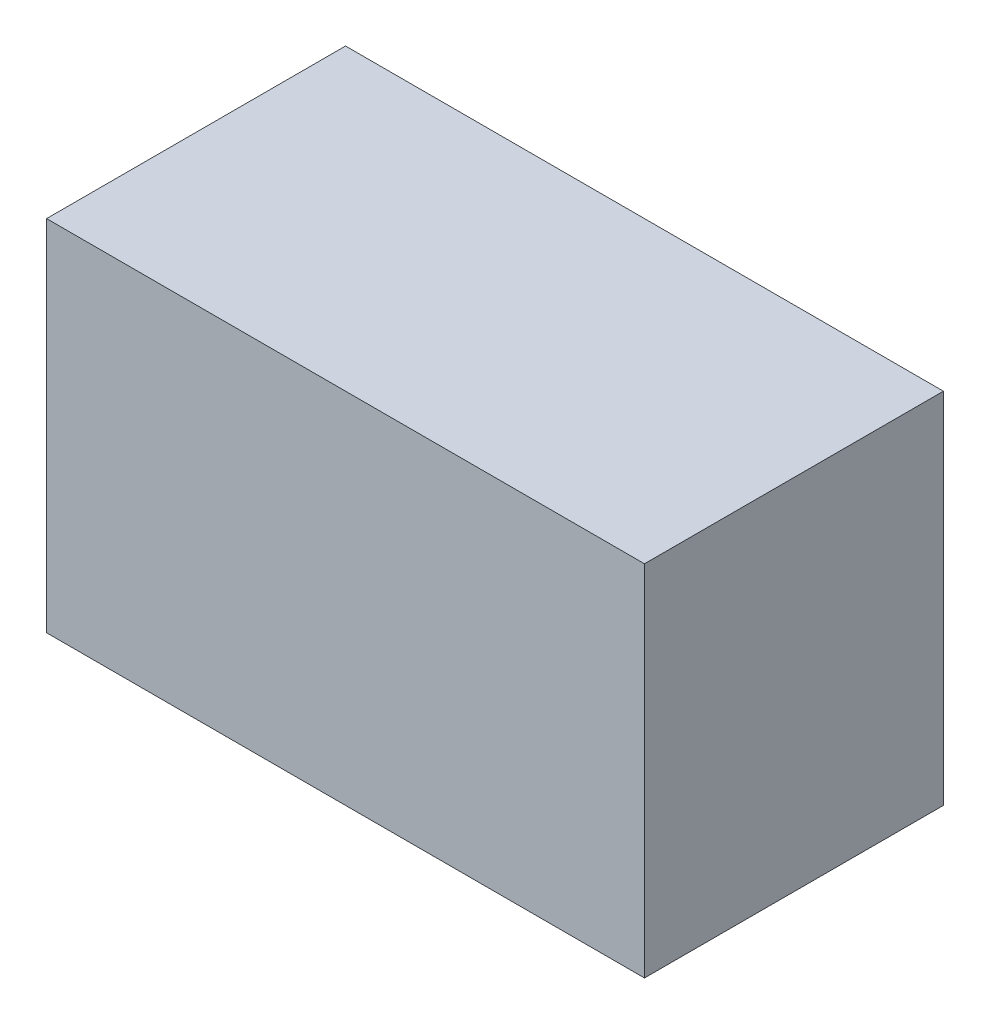
ISO-10303-21;
HEADER;
FILE_DESCRIPTION(('STEP AP214'),'2;1');
FILE_NAME('part.step','',(''),(''),'','','');
FILE_SCHEMA(('AUTOMOTIVE_DESIGN { 1 0 10303 214 1 1 1 1 }'));
ENDSEC;
DATA;
#1=APPLICATION_CONTEXT('core data for automotive mechanical design processes');
#2=APPLICATION_PROTOCOL_DEFINITION('international standard','automotive_design',2000,#1);
#3=PRODUCT_CONTEXT('',#1,'mechanical');
#4=PRODUCT('Part','Part','',(#3));
#5=PRODUCT_RELATED_PRODUCT_CATEGORY('part','',(#4));
#6=PRODUCT_DEFINITION_FORMATION('','',#4);
#7=PRODUCT_DEFINITION_CONTEXT('part definition',#1,'design');
#8=PRODUCT_DEFINITION('design','',#6,#7);
#9=PRODUCT_DEFINITION_SHAPE('','',#8);
#10=(LENGTH_UNIT() NAMED_UNIT(*) SI_UNIT(.MILLI.,.METRE.));
#11=(NAMED_UNIT(*) PLANE_ANGLE_UNIT() SI_UNIT($,.RADIAN.));
#12=(NAMED_UNIT(*) SI_UNIT($,.STERADIAN.) SOLID_ANGLE_UNIT());
#13=UNCERTAINTY_MEASURE_WITH_UNIT(LENGTH_MEASURE(1.E-05),#10,'distance_accuracy_value','');
#14=(GEOMETRIC_REPRESENTATION_CONTEXT(3) GLOBAL_UNCERTAINTY_ASSIGNED_CONTEXT((#13)) GLOBAL_UNIT_ASSIGNED_CONTEXT((#10,
#11,#12)) REPRESENTATION_CONTEXT('',''));
#15=CARTESIAN_POINT('',(0.,0.,0.));
#16=DIRECTION('',(0.,0.,1.));
#17=DIRECTION('',(1.,0.,0.));
#18=AXIS2_PLACEMENT_3D('',#15,#16,#17);
#19=CARTESIAN_POINT('',(15.,18.,15.));
#20=DIRECTION('',(-1.,0.,0.));
#21=DIRECTION('',(0.,0.,1.));
#22=AXIS2_PLACEMENT_3D('',#19,#20,#21);
#23=PLANE('',#22);
#24=DIRECTION('',(0.,0.,-1.));
#25=VECTOR('',#24,1.);
#26=CARTESIAN_POINT('',(15.,18.,15.));
#27=LINE('',#26,#25);
#28=CARTESIAN_POINT('',(15.,18.,0.));
#29=VERTEX_POINT('',#28);
#30=CARTESIAN_POINT('',(15.,18.,-15.));
#31=VERTEX_POINT('',#30);
#32=EDGE_CURVE('E97',#29,#31,#27,.T.);
#33=ORIENTED_EDGE('',*,*,#32,.F.);
#34=DIRECTION('',(0.,1.,0.));
#35=VECTOR('',#34,1.);
#36=CARTESIAN_POINT('',(15.,0.,0.));
#37=LINE('',#36,#35);
#38=CARTESIAN_POINT('',(15.,0.,0.));
#39=VERTEX_POINT('',#38);
#40=EDGE_CURVE('E85',#39,#29,#37,.T.);
#41=ORIENTED_EDGE('',*,*,#40,.F.);
#42=DIRECTION('',(0.,0.,-1.));
#43=VECTOR('',#42,1.);
#44=CARTESIAN_POINT('',(15.,0.,15.));
#45=LINE('',#44,#43);
#46=CARTESIAN_POINT('',(15.,0.,-15.));
#47=VERTEX_POINT('',#46);
#48=EDGE_CURVE('E64',#39,#47,#45,.T.);
#49=ORIENTED_EDGE('',*,*,#48,.T.);
#50=DIRECTION('',(0.,-1.,0.));
#51=VECTOR('',#50,1.);
#52=CARTESIAN_POINT('',(15.,18.,-15.));
#53=LINE('',#52,#51);
#54=EDGE_CURVE('E11',#31,#47,#53,.T.);
#55=ORIENTED_EDGE('',*,*,#54,.F.);
#56=EDGE_LOOP('',(#33,#41,#49,#55));
#57=FACE_BOUND('',#56,.T.);
#58=ADVANCED_FACE('F37',(#57),#23,.F.);
#59=CARTESIAN_POINT('',(-15.,18.,-15.));
#60=DIRECTION('',(0.,0.,1.));
#61=DIRECTION('',(1.,0.,0.));
#62=AXIS2_PLACEMENT_3D('',#59,#60,#61);
#63=PLANE('',#62);
#64=DIRECTION('',(-1.,0.,0.));
#65=VECTOR('',#64,1.);
#66=CARTESIAN_POINT('',(-15.,0.,-15.));
#67=LINE('',#66,#65);
#68=CARTESIAN_POINT('',(-15.,0.,-15.));
#69=VERTEX_POINT('',#68);
#70=EDGE_CURVE('E98',#47,#69,#67,.T.);
#71=ORIENTED_EDGE('',*,*,#70,.T.);
#72=DIRECTION('',(0.,-1.,0.));
#73=VECTOR('',#72,1.);
#74=CARTESIAN_POINT('',(-15.,18.,-15.));
#75=LINE('',#74,#73);
#76=CARTESIAN_POINT('',(-15.,18.,-15.));
#77=VERTEX_POINT('',#76);
#78=EDGE_CURVE('E45',#77,#69,#75,.T.);
#79=ORIENTED_EDGE('',*,*,#78,.F.);
#80=DIRECTION('',(-1.,0.,0.));
#81=VECTOR('',#80,1.);
#82=CARTESIAN_POINT('',(-15.,18.,-15.));
#83=LINE('',#82,#81);
#84=EDGE_CURVE('E53',#31,#77,#83,.T.);
#85=ORIENTED_EDGE('',*,*,#84,.F.);
#86=ORIENTED_EDGE('',*,*,#54,.T.);
#87=EDGE_LOOP('',(#71,#79,#85,#86));
#88=FACE_BOUND('',#87,.T.);
#89=ADVANCED_FACE('F111',(#88),#63,.F.);
#90=CARTESIAN_POINT('',(-15.,18.,15.));
#91=DIRECTION('',(1.,0.,0.));
#92=DIRECTION('',(0.,0.,-1.));
#93=AXIS2_PLACEMENT_3D('',#90,#91,#92);
#94=PLANE('',#93);
#95=DIRECTION('',(0.,0.,1.));
#96=VECTOR('',#95,1.);
#97=CARTESIAN_POINT('',(-15.,0.,15.));
#98=LINE('',#97,#96);
#99=CARTESIAN_POINT('',(-15.,0.,0.));
#100=VERTEX_POINT('',#99);
#101=EDGE_CURVE('E84',#69,#100,#98,.T.);
#102=ORIENTED_EDGE('',*,*,#101,.T.);
#103=DIRECTION('',(0.,1.,0.));
#104=VECTOR('',#103,1.);
#105=CARTESIAN_POINT('',(-15.,0.,0.));
#106=LINE('',#105,#104);
#107=CARTESIAN_POINT('',(-15.,18.,0.));
#108=VERTEX_POINT('',#107);
#109=EDGE_CURVE('E89',#100,#108,#106,.T.);
#110=ORIENTED_EDGE('',*,*,#109,.T.);
#111=DIRECTION('',(0.,0.,1.));
#112=VECTOR('',#111,1.);
#113=CARTESIAN_POINT('',(-15.,18.,15.));
#114=LINE('',#113,#112);
#115=EDGE_CURVE('E103',#77,#108,#114,.T.);
#116=ORIENTED_EDGE('',*,*,#115,.F.);
#117=ORIENTED_EDGE('',*,*,#78,.T.);
#118=EDGE_LOOP('',(#102,#110,#116,#117));
#119=FACE_BOUND('',#118,.T.);
#120=ADVANCED_FACE('F96',(#119),#94,.F.);
#121=CARTESIAN_POINT('',(0.,18.,0.));
#122=DIRECTION('',(0.,-1.,0.));
#123=DIRECTION('',(0.,0.,-1.));
#124=AXIS2_PLACEMENT_3D('',#121,#122,#123);
#125=PLANE('',#124);
#126=ORIENTED_EDGE('',*,*,#115,.T.);
#127=DIRECTION('',(-1.,0.,0.));
#128=VECTOR('',#127,1.);
#129=CARTESIAN_POINT('',(15.,18.,0.));
#130=LINE('',#129,#128);
#131=EDGE_CURVE('E86',#29,#108,#130,.T.);
#132=ORIENTED_EDGE('',*,*,#131,.F.);
#133=ORIENTED_EDGE('',*,*,#32,.T.);
#134=ORIENTED_EDGE('',*,*,#84,.T.);
#135=EDGE_LOOP('',(#126,#132,#133,#134));
#136=FACE_BOUND('',#135,.T.);
#137=ADVANCED_FACE('F109',(#136),#125,.F.);
#138=CARTESIAN_POINT('',(0.,0.,0.));
#139=DIRECTION('',(0.,-1.,0.));
#140=DIRECTION('',(0.,0.,-1.));
#141=AXIS2_PLACEMENT_3D('',#138,#139,#140);
#142=PLANE('',#141);
#143=DIRECTION('',(-1.,0.,0.));
#144=VECTOR('',#143,1.);
#145=CARTESIAN_POINT('',(15.,0.,0.));
#146=LINE('',#145,#144);
#147=EDGE_CURVE('E74',#39,#100,#146,.T.);
#148=ORIENTED_EDGE('',*,*,#147,.T.);
#149=ORIENTED_EDGE('',*,*,#101,.F.);
#150=ORIENTED_EDGE('',*,*,#70,.F.);
#151=ORIENTED_EDGE('',*,*,#48,.F.);
#152=EDGE_LOOP('',(#148,#149,#150,#151));
#153=FACE_BOUND('',#152,.T.);
#154=ADVANCED_FACE('F82',(#153),#142,.T.);
#155=CARTESIAN_POINT('',(15.,0.,0.));
#156=DIRECTION('',(0.,0.,-1.));
#157=DIRECTION('',(-1.,0.,0.));
#158=AXIS2_PLACEMENT_3D('',#155,#156,#157);
#159=PLANE('',#158);
#160=ORIENTED_EDGE('',*,*,#131,.T.);
#161=ORIENTED_EDGE('',*,*,#109,.F.);
#162=ORIENTED_EDGE('',*,*,#147,.F.);
#163=ORIENTED_EDGE('',*,*,#40,.T.);
#164=EDGE_LOOP('',(#160,#161,#162,#163));
#165=FACE_BOUND('',#164,.T.);
#166=ADVANCED_FACE('F90',(#165),#159,.F.);
#167=CLOSED_SHELL('',(#58,#89,#120,#137,#154,#166));
#168=MANIFOLD_SOLID_BREP('B2',#167);
#169=ADVANCED_BREP_SHAPE_REPRESENTATION('',(#18,#168),#14);
#170=SHAPE_DEFINITION_REPRESENTATION(#9,#169);
ENDSEC;
END-ISO-10303-21;
